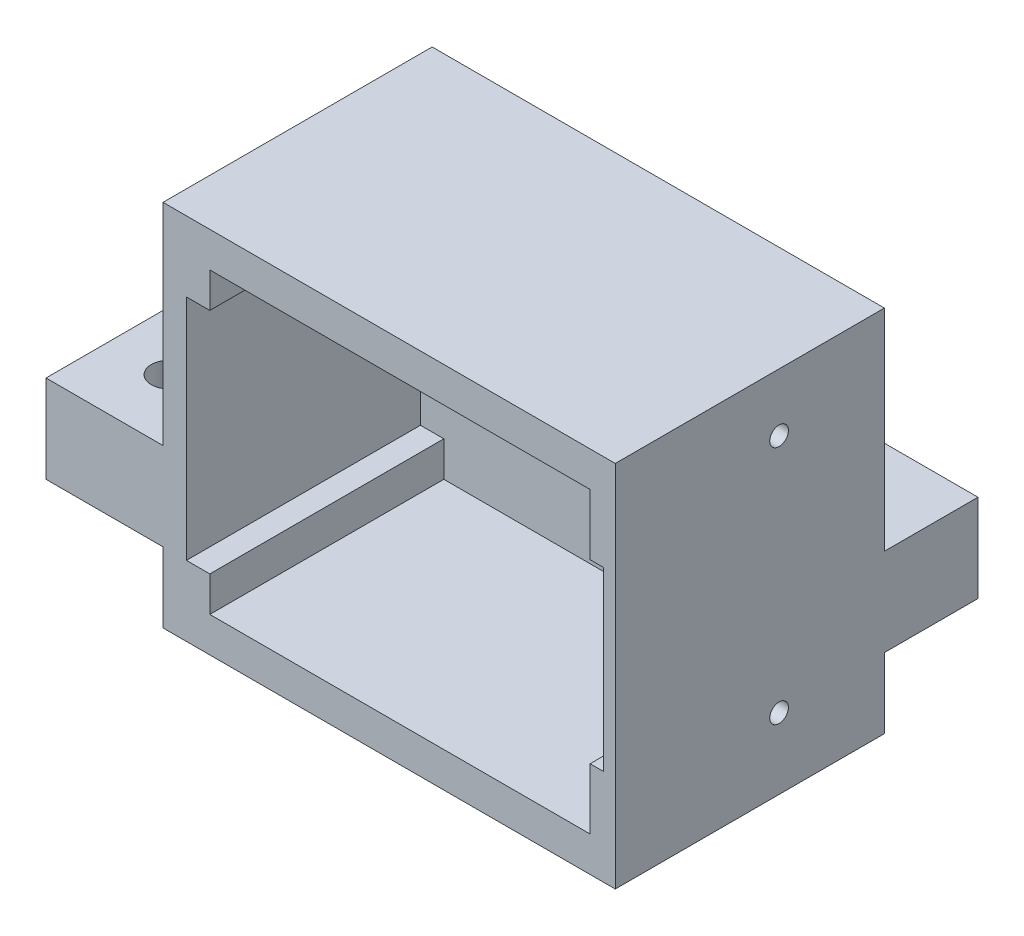
ISO-10303-21;
HEADER;
FILE_DESCRIPTION(('STEP AP214'),'2;1');
FILE_NAME('part.step','',(''),(''),'','','');
FILE_SCHEMA(('AUTOMOTIVE_DESIGN { 1 0 10303 214 1 1 1 1 }'));
ENDSEC;
DATA;
#1=APPLICATION_CONTEXT('core data for automotive mechanical design processes');
#2=APPLICATION_PROTOCOL_DEFINITION('international standard','automotive_design',2000,#1);
#3=PRODUCT_CONTEXT('',#1,'mechanical');
#4=PRODUCT('Part','Part','',(#3));
#5=PRODUCT_RELATED_PRODUCT_CATEGORY('part','',(#4));
#6=PRODUCT_DEFINITION_FORMATION('','',#4);
#7=PRODUCT_DEFINITION_CONTEXT('part definition',#1,'design');
#8=PRODUCT_DEFINITION('design','',#6,#7);
#9=PRODUCT_DEFINITION_SHAPE('','',#8);
#10=(LENGTH_UNIT() NAMED_UNIT(*) SI_UNIT(.MILLI.,.METRE.));
#11=(NAMED_UNIT(*) PLANE_ANGLE_UNIT() SI_UNIT($,.RADIAN.));
#12=(NAMED_UNIT(*) SI_UNIT($,.STERADIAN.) SOLID_ANGLE_UNIT());
#13=UNCERTAINTY_MEASURE_WITH_UNIT(LENGTH_MEASURE(1.E-05),#10,'distance_accuracy_value','');
#14=(GEOMETRIC_REPRESENTATION_CONTEXT(3) GLOBAL_UNCERTAINTY_ASSIGNED_CONTEXT((#13)) GLOBAL_UNIT_ASSIGNED_CONTEXT((#10,
#11,#12)) REPRESENTATION_CONTEXT('',''));
#15=CARTESIAN_POINT('',(0.,0.,0.));
#16=DIRECTION('',(0.,0.,1.));
#17=DIRECTION('',(1.,0.,0.));
#18=AXIS2_PLACEMENT_3D('',#15,#16,#17);
#19=CARTESIAN_POINT('',(0.,31.5,0.));
#20=DIRECTION('',(1.,0.,0.));
#21=DIRECTION('',(0.,0.,-1.));
#22=AXIS2_PLACEMENT_3D('',#19,#20,#21);
#23=PLANE('',#22);
#24=DIRECTION('',(0.,0.,-1.));
#25=VECTOR('',#24,1.);
#26=CARTESIAN_POINT('',(0.,13.5,0.));
#27=LINE('',#26,#25);
#28=CARTESIAN_POINT('',(0.,13.5,0.));
#29=VERTEX_POINT('',#28);
#30=CARTESIAN_POINT('',(0.,13.5,-23.));
#31=VERTEX_POINT('',#30);
#32=EDGE_CURVE('E213',#29,#31,#27,.T.);
#33=ORIENTED_EDGE('',*,*,#32,.F.);
#34=DIRECTION('',(0.,-1.,0.));
#35=VECTOR('',#34,1.);
#36=CARTESIAN_POINT('',(0.,31.5,0.));
#37=LINE('',#36,#35);
#38=CARTESIAN_POINT('',(0.,31.5,0.));
#39=VERTEX_POINT('',#38);
#40=EDGE_CURVE('E11',#39,#29,#37,.T.);
#41=ORIENTED_EDGE('',*,*,#40,.F.);
#42=DIRECTION('',(0.,0.,1.));
#43=VECTOR('',#42,1.);
#44=CARTESIAN_POINT('',(0.,31.5,0.));
#45=LINE('',#44,#43);
#46=CARTESIAN_POINT('',(0.,31.5,-23.));
#47=VERTEX_POINT('',#46);
#48=EDGE_CURVE('E400',#47,#39,#45,.T.);
#49=ORIENTED_EDGE('',*,*,#48,.F.);
#50=DIRECTION('',(0.,-1.,0.));
#51=VECTOR('',#50,1.);
#52=CARTESIAN_POINT('',(0.,31.5,-23.));
#53=LINE('',#52,#51);
#54=EDGE_CURVE('E419',#47,#31,#53,.T.);
#55=ORIENTED_EDGE('',*,*,#54,.T.);
#56=EDGE_LOOP('',(#33,#41,#49,#55));
#57=FACE_BOUND('',#56,.T.);
#58=ADVANCED_FACE('F44',(#57),#23,.F.);
#59=CARTESIAN_POINT('',(0.,6.,0.));
#60=VERTEX_POINT('',#59);
#61=CARTESIAN_POINT('',(0.,0.,0.));
#62=VERTEX_POINT('',#61);
#63=EDGE_CURVE('E52',#60,#62,#37,.T.);
#64=ORIENTED_EDGE('',*,*,#63,.F.);
#65=DIRECTION('',(0.,0.,-1.));
#66=VECTOR('',#65,1.);
#67=CARTESIAN_POINT('',(0.,6.,0.));
#68=LINE('',#67,#66);
#69=CARTESIAN_POINT('',(0.,6.,-23.));
#70=VERTEX_POINT('',#69);
#71=EDGE_CURVE('E59',#60,#70,#68,.T.);
#72=ORIENTED_EDGE('',*,*,#71,.T.);
#73=CARTESIAN_POINT('',(0.,0.,-23.));
#74=VERTEX_POINT('',#73);
#75=EDGE_CURVE('E410',#70,#74,#53,.T.);
#76=ORIENTED_EDGE('',*,*,#75,.T.);
#77=DIRECTION('',(0.,0.,1.));
#78=VECTOR('',#77,1.);
#79=CARTESIAN_POINT('',(0.,0.,0.));
#80=LINE('',#79,#78);
#81=EDGE_CURVE('E377',#74,#62,#80,.T.);
#82=ORIENTED_EDGE('',*,*,#81,.T.);
#83=EDGE_LOOP('',(#64,#72,#76,#82));
#84=FACE_BOUND('',#83,.T.);
#85=ADVANCED_FACE('F46',(#84),#23,.F.);
#86=CARTESIAN_POINT('',(0.,31.5,0.));
#87=DIRECTION('',(0.,0.,-1.));
#88=DIRECTION('',(-1.,0.,0.));
#89=AXIS2_PLACEMENT_3D('',#86,#87,#88);
#90=PLANE('',#89);
#91=DIRECTION('',(-1.,0.,0.));
#92=VECTOR('',#91,1.);
#93=CARTESIAN_POINT('',(4.,25.5,0.));
#94=LINE('',#93,#92);
#95=CARTESIAN_POINT('',(4.,25.5,0.));
#96=VERTEX_POINT('',#95);
#97=CARTESIAN_POINT('',(2.,25.5,0.));
#98=VERTEX_POINT('',#97);
#99=EDGE_CURVE('E343',#96,#98,#94,.T.);
#100=ORIENTED_EDGE('',*,*,#99,.F.);
#101=DIRECTION('',(0.,-1.,0.));
#102=VECTOR('',#101,1.);
#103=CARTESIAN_POINT('',(4.,28.5,0.));
#104=LINE('',#103,#102);
#105=CARTESIAN_POINT('',(4.,28.5,0.));
#106=VERTEX_POINT('',#105);
#107=EDGE_CURVE('E299',#106,#96,#104,.T.);
#108=ORIENTED_EDGE('',*,*,#107,.F.);
#109=DIRECTION('',(-1.,0.,0.));
#110=VECTOR('',#109,1.);
#111=CARTESIAN_POINT('',(36.5,28.5,0.));
#112=LINE('',#111,#110);
#113=CARTESIAN_POINT('',(36.5,28.5,0.));
#114=VERTEX_POINT('',#113);
#115=EDGE_CURVE('E308',#114,#106,#112,.T.);
#116=ORIENTED_EDGE('',*,*,#115,.F.);
#117=DIRECTION('',(0.,1.,0.));
#118=VECTOR('',#117,1.);
#119=CARTESIAN_POINT('',(36.5,23.3,0.));
#120=LINE('',#119,#118);
#121=CARTESIAN_POINT('',(36.5,23.3,0.));
#122=VERTEX_POINT('',#121);
#123=EDGE_CURVE('E370',#122,#114,#120,.T.);
#124=ORIENTED_EDGE('',*,*,#123,.F.);
#125=DIRECTION('',(-1.,0.,0.));
#126=VECTOR('',#125,1.);
#127=CARTESIAN_POINT('',(37.65,23.3,0.));
#128=LINE('',#127,#126);
#129=CARTESIAN_POINT('',(37.65,23.3,0.));
#130=VERTEX_POINT('',#129);
#131=EDGE_CURVE('E367',#130,#122,#128,.T.);
#132=ORIENTED_EDGE('',*,*,#131,.F.);
#133=DIRECTION('',(0.,1.,0.));
#134=VECTOR('',#133,1.);
#135=CARTESIAN_POINT('',(37.65,8.2,0.));
#136=LINE('',#135,#134);
#137=CARTESIAN_POINT('',(37.65,8.2,0.));
#138=VERTEX_POINT('',#137);
#139=EDGE_CURVE('E364',#138,#130,#136,.T.);
#140=ORIENTED_EDGE('',*,*,#139,.F.);
#141=DIRECTION('',(1.,0.,0.));
#142=VECTOR('',#141,1.);
#143=CARTESIAN_POINT('',(36.5,8.2,0.));
#144=LINE('',#143,#142);
#145=CARTESIAN_POINT('',(36.5,8.2,0.));
#146=VERTEX_POINT('',#145);
#147=EDGE_CURVE('E361',#146,#138,#144,.T.);
#148=ORIENTED_EDGE('',*,*,#147,.F.);
#149=DIRECTION('',(0.,1.,0.));
#150=VECTOR('',#149,1.);
#151=CARTESIAN_POINT('',(36.5,3.,0.));
#152=LINE('',#151,#150);
#153=CARTESIAN_POINT('',(36.5,3.,0.));
#154=VERTEX_POINT('',#153);
#155=EDGE_CURVE('E358',#154,#146,#152,.T.);
#156=ORIENTED_EDGE('',*,*,#155,.F.);
#157=DIRECTION('',(1.,0.,0.));
#158=VECTOR('',#157,1.);
#159=CARTESIAN_POINT('',(4.,3.,0.));
#160=LINE('',#159,#158);
#161=CARTESIAN_POINT('',(4.,3.,0.));
#162=VERTEX_POINT('',#161);
#163=EDGE_CURVE('E355',#162,#154,#160,.T.);
#164=ORIENTED_EDGE('',*,*,#163,.F.);
#165=DIRECTION('',(0.,-1.,0.));
#166=VECTOR('',#165,1.);
#167=CARTESIAN_POINT('',(4.,6.,0.));
#168=LINE('',#167,#166);
#169=CARTESIAN_POINT('',(4.,6.,0.));
#170=VERTEX_POINT('',#169);
#171=EDGE_CURVE('E352',#170,#162,#168,.T.);
#172=ORIENTED_EDGE('',*,*,#171,.F.);
#173=DIRECTION('',(1.,0.,0.));
#174=VECTOR('',#173,1.);
#175=CARTESIAN_POINT('',(2.,6.,0.));
#176=LINE('',#175,#174);
#177=CARTESIAN_POINT('',(2.,6.,0.));
#178=VERTEX_POINT('',#177);
#179=EDGE_CURVE('E349',#178,#170,#176,.T.);
#180=ORIENTED_EDGE('',*,*,#179,.F.);
#181=DIRECTION('',(0.,-1.,0.));
#182=VECTOR('',#181,1.);
#183=CARTESIAN_POINT('',(2.,25.5,0.));
#184=LINE('',#183,#182);
#185=EDGE_CURVE('E346',#98,#178,#184,.T.);
#186=ORIENTED_EDGE('',*,*,#185,.F.);
#187=EDGE_LOOP('',(#100,#108,#116,#124,#132,#140,#148,#156,#164,#172,#180,#186));
#188=FACE_BOUND('',#187,.T.);
#189=DIRECTION('',(1.,0.,0.));
#190=VECTOR('',#189,1.);
#191=CARTESIAN_POINT('',(0.,0.,0.));
#192=LINE('',#191,#190);
#193=CARTESIAN_POINT('',(38.65,0.,0.));
#194=VERTEX_POINT('',#193);
#195=EDGE_CURVE('E412',#62,#194,#192,.T.);
#196=ORIENTED_EDGE('',*,*,#195,.T.);
#197=DIRECTION('',(0.,-1.,0.));
#198=VECTOR('',#197,1.);
#199=CARTESIAN_POINT('',(38.65,31.5,0.));
#200=LINE('',#199,#198);
#201=CARTESIAN_POINT('',(38.65,31.5,0.));
#202=VERTEX_POINT('',#201);
#203=EDGE_CURVE('E424',#202,#194,#200,.T.);
#204=ORIENTED_EDGE('',*,*,#203,.F.);
#205=DIRECTION('',(1.,0.,0.));
#206=VECTOR('',#205,1.);
#207=CARTESIAN_POINT('',(0.,31.5,0.));
#208=LINE('',#207,#206);
#209=EDGE_CURVE('E403',#39,#202,#208,.T.);
#210=ORIENTED_EDGE('',*,*,#209,.F.);
#211=ORIENTED_EDGE('',*,*,#40,.T.);
#212=DIRECTION('',(-1.,0.,0.));
#213=VECTOR('',#212,1.);
#214=CARTESIAN_POINT('',(0.,13.5,0.));
#215=LINE('',#214,#213);
#216=CARTESIAN_POINT('',(-10.,13.5,0.));
#217=VERTEX_POINT('',#216);
#218=EDGE_CURVE('E219',#29,#217,#215,.T.);
#219=ORIENTED_EDGE('',*,*,#218,.T.);
#220=DIRECTION('',(0.,-1.,0.));
#221=VECTOR('',#220,1.);
#222=CARTESIAN_POINT('',(-10.,13.5,0.));
#223=LINE('',#222,#221);
#224=CARTESIAN_POINT('',(-10.,6.,0.));
#225=VERTEX_POINT('',#224);
#226=EDGE_CURVE('E202',#217,#225,#223,.T.);
#227=ORIENTED_EDGE('',*,*,#226,.T.);
#228=DIRECTION('',(-1.,0.,0.));
#229=VECTOR('',#228,1.);
#230=CARTESIAN_POINT('',(0.,6.,0.));
#231=LINE('',#230,#229);
#232=EDGE_CURVE('E241',#60,#225,#231,.T.);
#233=ORIENTED_EDGE('',*,*,#232,.F.);
#234=ORIENTED_EDGE('',*,*,#63,.T.);
#235=EDGE_LOOP('',(#196,#204,#210,#211,#219,#227,#233,#234));
#236=FACE_BOUND('',#235,.T.);
#237=ADVANCED_FACE('F224',(#188,#236),#90,.F.);
#238=CARTESIAN_POINT('',(38.65,31.5,0.));
#239=DIRECTION('',(-1.,0.,0.));
#240=DIRECTION('',(0.,0.,1.));
#241=AXIS2_PLACEMENT_3D('',#238,#239,#240);
#242=PLANE('',#241);
#243=CARTESIAN_POINT('',(38.65,26.55,-14.));
#244=DIRECTION('',(-1.,0.,0.));
#245=DIRECTION('',(0.,0.,1.));
#246=AXIS2_PLACEMENT_3D('',#243,#244,#245);
#247=CIRCLE('',#246,0.8);
#248=CARTESIAN_POINT('',(38.65,26.55,-13.2));
#249=VERTEX_POINT('',#248);
#250=EDGE_CURVE('E295',#249,#249,#247,.F.);
#251=ORIENTED_EDGE('',*,*,#250,.F.);
#252=EDGE_LOOP('',(#251));
#253=FACE_BOUND('',#252,.T.);
#254=CARTESIAN_POINT('',(38.65,6.05,-14.));
#255=DIRECTION('',(-1.,0.,0.));
#256=DIRECTION('',(0.,0.,1.));
#257=AXIS2_PLACEMENT_3D('',#254,#255,#256);
#258=CIRCLE('',#257,0.800000000000001);
#259=CARTESIAN_POINT('',(38.65,6.05,-13.2));
#260=VERTEX_POINT('',#259);
#261=EDGE_CURVE('E296',#260,#260,#258,.F.);
#262=ORIENTED_EDGE('',*,*,#261,.F.);
#263=EDGE_LOOP('',(#262));
#264=FACE_BOUND('',#263,.T.);
#265=DIRECTION('',(0.,0.,-1.));
#266=VECTOR('',#265,1.);
#267=CARTESIAN_POINT('',(38.65,0.,0.));
#268=LINE('',#267,#266);
#269=CARTESIAN_POINT('',(38.65,0.,-23.));
#270=VERTEX_POINT('',#269);
#271=EDGE_CURVE('E414',#194,#270,#268,.T.);
#272=ORIENTED_EDGE('',*,*,#271,.T.);
#273=DIRECTION('',(0.,-1.,0.));
#274=VECTOR('',#273,1.);
#275=CARTESIAN_POINT('',(38.65,31.5,-23.));
#276=LINE('',#275,#274);
#277=CARTESIAN_POINT('',(38.65,6.,-23.));
#278=VERTEX_POINT('',#277);
#279=EDGE_CURVE('E421',#278,#270,#276,.T.);
#280=ORIENTED_EDGE('',*,*,#279,.F.);
#281=DIRECTION('',(0.,0.,-1.));
#282=VECTOR('',#281,1.);
#283=CARTESIAN_POINT('',(38.65,6.,0.));
#284=LINE('',#283,#282);
#285=CARTESIAN_POINT('',(38.65,6.,-31.));
#286=VERTEX_POINT('',#285);
#287=EDGE_CURVE('E254',#278,#286,#284,.T.);
#288=ORIENTED_EDGE('',*,*,#287,.T.);
#289=DIRECTION('',(0.,-1.,0.));
#290=VECTOR('',#289,1.);
#291=CARTESIAN_POINT('',(38.65,13.5,-31.));
#292=LINE('',#291,#290);
#293=CARTESIAN_POINT('',(38.65,13.5,-31.));
#294=VERTEX_POINT('',#293);
#295=EDGE_CURVE('E285',#294,#286,#292,.T.);
#296=ORIENTED_EDGE('',*,*,#295,.F.);
#297=DIRECTION('',(0.,0.,-1.));
#298=VECTOR('',#297,1.);
#299=CARTESIAN_POINT('',(38.65,13.5,0.));
#300=LINE('',#299,#298);
#301=CARTESIAN_POINT('',(38.65,13.5,-23.));
#302=VERTEX_POINT('',#301);
#303=EDGE_CURVE('E266',#302,#294,#300,.T.);
#304=ORIENTED_EDGE('',*,*,#303,.F.);
#305=CARTESIAN_POINT('',(38.65,31.5,-23.));
#306=VERTEX_POINT('',#305);
#307=EDGE_CURVE('E422',#306,#302,#276,.T.);
#308=ORIENTED_EDGE('',*,*,#307,.F.);
#309=DIRECTION('',(0.,0.,-1.));
#310=VECTOR('',#309,1.);
#311=CARTESIAN_POINT('',(38.65,31.5,0.));
#312=LINE('',#311,#310);
#313=EDGE_CURVE('E406',#202,#306,#312,.T.);
#314=ORIENTED_EDGE('',*,*,#313,.F.);
#315=ORIENTED_EDGE('',*,*,#203,.T.);
#316=EDGE_LOOP('',(#272,#280,#288,#296,#304,#308,#314,#315));
#317=FACE_BOUND('',#316,.T.);
#318=ADVANCED_FACE('F440',(#253,#264,#317),#242,.F.);
#319=CARTESIAN_POINT('',(0.,31.5,-23.));
#320=DIRECTION('',(0.,0.,1.));
#321=DIRECTION('',(1.,0.,0.));
#322=AXIS2_PLACEMENT_3D('',#319,#320,#321);
#323=PLANE('',#322);
#324=DIRECTION('',(0.,-1.,0.));
#325=VECTOR('',#324,1.);
#326=CARTESIAN_POINT('',(1.,13.5,-23.));
#327=LINE('',#326,#325);
#328=CARTESIAN_POINT('',(1.,13.5,-23.));
#329=VERTEX_POINT('',#328);
#330=CARTESIAN_POINT('',(1.,6.,-23.));
#331=VERTEX_POINT('',#330);
#332=EDGE_CURVE('E268',#329,#331,#327,.T.);
#333=ORIENTED_EDGE('',*,*,#332,.T.);
#334=DIRECTION('',(1.,0.,0.));
#335=VECTOR('',#334,1.);
#336=CARTESIAN_POINT('',(0.,6.,-23.));
#337=LINE('',#336,#335);
#338=EDGE_CURVE('E274',#331,#278,#337,.T.);
#339=ORIENTED_EDGE('',*,*,#338,.T.);
#340=ORIENTED_EDGE('',*,*,#279,.T.);
#341=DIRECTION('',(-1.,0.,0.));
#342=VECTOR('',#341,1.);
#343=CARTESIAN_POINT('',(0.,0.,-23.));
#344=LINE('',#343,#342);
#345=EDGE_CURVE('E404',#270,#74,#344,.T.);
#346=ORIENTED_EDGE('',*,*,#345,.T.);
#347=ORIENTED_EDGE('',*,*,#75,.F.);
#348=DIRECTION('',(-1.,0.,0.));
#349=VECTOR('',#348,1.);
#350=CARTESIAN_POINT('',(0.,6.,-23.));
#351=LINE('',#350,#349);
#352=CARTESIAN_POINT('',(-9.99999999999999,6.,-23.));
#353=VERTEX_POINT('',#352);
#354=EDGE_CURVE('E244',#70,#353,#351,.T.);
#355=ORIENTED_EDGE('',*,*,#354,.T.);
#356=DIRECTION('',(0.,-1.,0.));
#357=VECTOR('',#356,1.);
#358=CARTESIAN_POINT('',(-9.99999999999999,13.5,-23.));
#359=LINE('',#358,#357);
#360=CARTESIAN_POINT('',(-9.99999999999999,13.5,-23.));
#361=VERTEX_POINT('',#360);
#362=EDGE_CURVE('E212',#361,#353,#359,.T.);
#363=ORIENTED_EDGE('',*,*,#362,.F.);
#364=DIRECTION('',(-1.,0.,0.));
#365=VECTOR('',#364,1.);
#366=CARTESIAN_POINT('',(0.,13.5,-23.));
#367=LINE('',#366,#365);
#368=EDGE_CURVE('E221',#31,#361,#367,.T.);
#369=ORIENTED_EDGE('',*,*,#368,.F.);
#370=ORIENTED_EDGE('',*,*,#54,.F.);
#371=DIRECTION('',(-1.,0.,0.));
#372=VECTOR('',#371,1.);
#373=CARTESIAN_POINT('',(0.,31.5,-23.));
#374=LINE('',#373,#372);
#375=EDGE_CURVE('E408',#306,#47,#374,.T.);
#376=ORIENTED_EDGE('',*,*,#375,.F.);
#377=ORIENTED_EDGE('',*,*,#307,.T.);
#378=DIRECTION('',(1.,0.,0.));
#379=VECTOR('',#378,1.);
#380=CARTESIAN_POINT('',(0.,13.5,-23.));
#381=LINE('',#380,#379);
#382=EDGE_CURVE('E257',#329,#302,#381,.T.);
#383=ORIENTED_EDGE('',*,*,#382,.F.);
#384=EDGE_LOOP('',(#333,#339,#340,#346,#347,#355,#363,#369,#370,#376,#377,#383));
#385=FACE_BOUND('',#384,.T.);
#386=ADVANCED_FACE('F437',(#385),#323,.F.);
#387=CARTESIAN_POINT('',(0.,31.5,0.));
#388=DIRECTION('',(0.,-1.,0.));
#389=DIRECTION('',(0.,0.,-1.));
#390=AXIS2_PLACEMENT_3D('',#387,#388,#389);
#391=PLANE('',#390);
#392=ORIENTED_EDGE('',*,*,#48,.T.);
#393=ORIENTED_EDGE('',*,*,#209,.T.);
#394=ORIENTED_EDGE('',*,*,#313,.T.);
#395=ORIENTED_EDGE('',*,*,#375,.T.);
#396=EDGE_LOOP('',(#392,#393,#394,#395));
#397=FACE_BOUND('',#396,.T.);
#398=ADVANCED_FACE('F448',(#397),#391,.F.);
#399=CARTESIAN_POINT('',(0.,0.,0.));
#400=DIRECTION('',(0.,-1.,0.));
#401=DIRECTION('',(0.,0.,-1.));
#402=AXIS2_PLACEMENT_3D('',#399,#400,#401);
#403=PLANE('',#402);
#404=ORIENTED_EDGE('',*,*,#81,.F.);
#405=ORIENTED_EDGE('',*,*,#345,.F.);
#406=ORIENTED_EDGE('',*,*,#271,.F.);
#407=ORIENTED_EDGE('',*,*,#195,.F.);
#408=EDGE_LOOP('',(#404,#405,#406,#407));
#409=FACE_BOUND('',#408,.T.);
#410=ADVANCED_FACE('F433',(#409),#403,.T.);
#411=CARTESIAN_POINT('',(4.,28.5,-20.));
#412=DIRECTION('',(-1.,0.,0.));
#413=DIRECTION('',(0.,-1.,0.));
#414=AXIS2_PLACEMENT_3D('',#411,#412,#413);
#415=PLANE('',#414);
#416=ORIENTED_EDGE('',*,*,#107,.T.);
#417=DIRECTION('',(0.,0.,1.));
#418=VECTOR('',#417,1.);
#419=CARTESIAN_POINT('',(4.,25.5,-20.));
#420=LINE('',#419,#418);
#421=CARTESIAN_POINT('',(4.,25.5,-20.));
#422=VERTEX_POINT('',#421);
#423=EDGE_CURVE('E341',#422,#96,#420,.T.);
#424=ORIENTED_EDGE('',*,*,#423,.F.);
#425=DIRECTION('',(0.,-1.,0.));
#426=VECTOR('',#425,1.);
#427=CARTESIAN_POINT('',(4.,28.5,-20.));
#428=LINE('',#427,#426);
#429=CARTESIAN_POINT('',(4.,28.5,-20.));
#430=VERTEX_POINT('',#429);
#431=EDGE_CURVE('E304',#430,#422,#428,.T.);
#432=ORIENTED_EDGE('',*,*,#431,.F.);
#433=DIRECTION('',(0.,0.,1.));
#434=VECTOR('',#433,1.);
#435=CARTESIAN_POINT('',(4.,28.5,-20.));
#436=LINE('',#435,#434);
#437=EDGE_CURVE('E375',#430,#106,#436,.T.);
#438=ORIENTED_EDGE('',*,*,#437,.T.);
#439=EDGE_LOOP('',(#416,#424,#432,#438));
#440=FACE_BOUND('',#439,.T.);
#441=ADVANCED_FACE('F525',(#440),#415,.F.);
#442=CARTESIAN_POINT('',(36.5,28.5,-20.));
#443=DIRECTION('',(0.,1.,0.));
#444=DIRECTION('',(-1.,0.,0.));
#445=AXIS2_PLACEMENT_3D('',#442,#443,#444);
#446=PLANE('',#445);
#447=ORIENTED_EDGE('',*,*,#115,.T.);
#448=ORIENTED_EDGE('',*,*,#437,.F.);
#449=DIRECTION('',(-1.,0.,0.));
#450=VECTOR('',#449,1.);
#451=CARTESIAN_POINT('',(36.5,28.5,-20.));
#452=LINE('',#451,#450);
#453=CARTESIAN_POINT('',(36.5,28.5,-20.));
#454=VERTEX_POINT('',#453);
#455=EDGE_CURVE('E338',#454,#430,#452,.T.);
#456=ORIENTED_EDGE('',*,*,#455,.F.);
#457=DIRECTION('',(0.,0.,1.));
#458=VECTOR('',#457,1.);
#459=CARTESIAN_POINT('',(36.5,28.5,-20.));
#460=LINE('',#459,#458);
#461=EDGE_CURVE('E378',#454,#114,#460,.T.);
#462=ORIENTED_EDGE('',*,*,#461,.T.);
#463=EDGE_LOOP('',(#447,#448,#456,#462));
#464=FACE_BOUND('',#463,.T.);
#465=ADVANCED_FACE('F521',(#464),#446,.F.);
#466=CARTESIAN_POINT('',(36.5,23.3,-20.));
#467=DIRECTION('',(1.,0.,0.));
#468=DIRECTION('',(0.,1.,0.));
#469=AXIS2_PLACEMENT_3D('',#466,#467,#468);
#470=PLANE('',#469);
#471=CARTESIAN_POINT('',(36.5,26.55,-14.));
#472=DIRECTION('',(-1.,0.,0.));
#473=DIRECTION('',(0.,0.,1.));
#474=AXIS2_PLACEMENT_3D('',#471,#472,#473);
#475=CIRCLE('',#474,0.8);
#476=CARTESIAN_POINT('',(36.5,26.55,-13.2));
#477=VERTEX_POINT('',#476);
#478=EDGE_CURVE('E292',#477,#477,#475,.T.);
#479=ORIENTED_EDGE('',*,*,#478,.F.);
#480=EDGE_LOOP('',(#479));
#481=FACE_BOUND('',#480,.T.);
#482=ORIENTED_EDGE('',*,*,#123,.T.);
#483=ORIENTED_EDGE('',*,*,#461,.F.);
#484=DIRECTION('',(0.,1.,0.));
#485=VECTOR('',#484,1.);
#486=CARTESIAN_POINT('',(36.5,23.3,-20.));
#487=LINE('',#486,#485);
#488=CARTESIAN_POINT('',(36.5,23.3,-20.));
#489=VERTEX_POINT('',#488);
#490=EDGE_CURVE('E335',#489,#454,#487,.T.);
#491=ORIENTED_EDGE('',*,*,#490,.F.);
#492=DIRECTION('',(0.,0.,1.));
#493=VECTOR('',#492,1.);
#494=CARTESIAN_POINT('',(36.5,23.3,-20.));
#495=LINE('',#494,#493);
#496=EDGE_CURVE('E380',#489,#122,#495,.T.);
#497=ORIENTED_EDGE('',*,*,#496,.T.);
#498=EDGE_LOOP('',(#482,#483,#491,#497));
#499=FACE_BOUND('',#498,.T.);
#500=ADVANCED_FACE('F524',(#481,#499),#470,.F.);
#501=CARTESIAN_POINT('',(37.65,23.3,-20.));
#502=DIRECTION('',(0.,1.,0.));
#503=DIRECTION('',(0.,0.,1.));
#504=AXIS2_PLACEMENT_3D('',#501,#502,#503);
#505=PLANE('',#504);
#506=ORIENTED_EDGE('',*,*,#131,.T.);
#507=ORIENTED_EDGE('',*,*,#496,.F.);
#508=DIRECTION('',(-1.,0.,0.));
#509=VECTOR('',#508,1.);
#510=CARTESIAN_POINT('',(37.65,23.3,-20.));
#511=LINE('',#510,#509);
#512=CARTESIAN_POINT('',(37.65,23.3,-20.));
#513=VERTEX_POINT('',#512);
#514=EDGE_CURVE('E332',#513,#489,#511,.T.);
#515=ORIENTED_EDGE('',*,*,#514,.F.);
#516=DIRECTION('',(0.,0.,1.));
#517=VECTOR('',#516,1.);
#518=CARTESIAN_POINT('',(37.65,23.3,-20.));
#519=LINE('',#518,#517);
#520=EDGE_CURVE('E382',#513,#130,#519,.T.);
#521=ORIENTED_EDGE('',*,*,#520,.T.);
#522=EDGE_LOOP('',(#506,#507,#515,#521));
#523=FACE_BOUND('',#522,.T.);
#524=ADVANCED_FACE('F529',(#523),#505,.F.);
#525=CARTESIAN_POINT('',(37.65,8.2,-20.));
#526=DIRECTION('',(1.,0.,0.));
#527=DIRECTION('',(0.,0.,-1.));
#528=AXIS2_PLACEMENT_3D('',#525,#526,#527);
#529=PLANE('',#528);
#530=ORIENTED_EDGE('',*,*,#139,.T.);
#531=ORIENTED_EDGE('',*,*,#520,.F.);
#532=DIRECTION('',(0.,1.,0.));
#533=VECTOR('',#532,1.);
#534=CARTESIAN_POINT('',(37.65,8.2,-20.));
#535=LINE('',#534,#533);
#536=CARTESIAN_POINT('',(37.65,8.2,-20.));
#537=VERTEX_POINT('',#536);
#538=EDGE_CURVE('E329',#537,#513,#535,.T.);
#539=ORIENTED_EDGE('',*,*,#538,.F.);
#540=DIRECTION('',(0.,0.,1.));
#541=VECTOR('',#540,1.);
#542=CARTESIAN_POINT('',(37.65,8.2,-20.));
#543=LINE('',#542,#541);
#544=EDGE_CURVE('E384',#537,#138,#543,.T.);
#545=ORIENTED_EDGE('',*,*,#544,.T.);
#546=EDGE_LOOP('',(#530,#531,#539,#545));
#547=FACE_BOUND('',#546,.T.);
#548=ADVANCED_FACE('F533',(#547),#529,.F.);
#549=CARTESIAN_POINT('',(36.5,8.2,-20.));
#550=DIRECTION('',(0.,-1.,0.));
#551=DIRECTION('',(0.,0.,-1.));
#552=AXIS2_PLACEMENT_3D('',#549,#550,#551);
#553=PLANE('',#552);
#554=ORIENTED_EDGE('',*,*,#147,.T.);
#555=ORIENTED_EDGE('',*,*,#544,.F.);
#556=DIRECTION('',(1.,0.,0.));
#557=VECTOR('',#556,1.);
#558=CARTESIAN_POINT('',(36.5,8.2,-20.));
#559=LINE('',#558,#557);
#560=CARTESIAN_POINT('',(36.5,8.2,-20.));
#561=VERTEX_POINT('',#560);
#562=EDGE_CURVE('E326',#561,#537,#559,.T.);
#563=ORIENTED_EDGE('',*,*,#562,.F.);
#564=DIRECTION('',(0.,0.,1.));
#565=VECTOR('',#564,1.);
#566=CARTESIAN_POINT('',(36.5,8.2,-20.));
#567=LINE('',#566,#565);
#568=EDGE_CURVE('E386',#561,#146,#567,.T.);
#569=ORIENTED_EDGE('',*,*,#568,.T.);
#570=EDGE_LOOP('',(#554,#555,#563,#569));
#571=FACE_BOUND('',#570,.T.);
#572=ADVANCED_FACE('F537',(#571),#553,.F.);
#573=CARTESIAN_POINT('',(36.5,3.,-20.));
#574=DIRECTION('',(1.,0.,0.));
#575=DIRECTION('',(0.,0.,-1.));
#576=AXIS2_PLACEMENT_3D('',#573,#574,#575);
#577=PLANE('',#576);
#578=CARTESIAN_POINT('',(36.5,6.05,-14.));
#579=DIRECTION('',(-1.,0.,0.));
#580=DIRECTION('',(0.,0.,1.));
#581=AXIS2_PLACEMENT_3D('',#578,#579,#580);
#582=CIRCLE('',#581,0.800000000000001);
#583=CARTESIAN_POINT('',(36.5,6.05,-13.2));
#584=VERTEX_POINT('',#583);
#585=EDGE_CURVE('E287',#584,#584,#582,.T.);
#586=ORIENTED_EDGE('',*,*,#585,.F.);
#587=EDGE_LOOP('',(#586));
#588=FACE_BOUND('',#587,.T.);
#589=ORIENTED_EDGE('',*,*,#155,.T.);
#590=ORIENTED_EDGE('',*,*,#568,.F.);
#591=DIRECTION('',(0.,1.,0.));
#592=VECTOR('',#591,1.);
#593=CARTESIAN_POINT('',(36.5,3.,-20.));
#594=LINE('',#593,#592);
#595=CARTESIAN_POINT('',(36.5,3.,-20.));
#596=VERTEX_POINT('',#595);
#597=EDGE_CURVE('E323',#596,#561,#594,.T.);
#598=ORIENTED_EDGE('',*,*,#597,.F.);
#599=DIRECTION('',(0.,0.,1.));
#600=VECTOR('',#599,1.);
#601=CARTESIAN_POINT('',(36.5,3.,-20.));
#602=LINE('',#601,#600);
#603=EDGE_CURVE('E388',#596,#154,#602,.T.);
#604=ORIENTED_EDGE('',*,*,#603,.T.);
#605=EDGE_LOOP('',(#589,#590,#598,#604));
#606=FACE_BOUND('',#605,.T.);
#607=ADVANCED_FACE('F541',(#588,#606),#577,.F.);
#608=CARTESIAN_POINT('',(4.,3.,-20.));
#609=DIRECTION('',(0.,-1.,0.));
#610=DIRECTION('',(0.,0.,-1.));
#611=AXIS2_PLACEMENT_3D('',#608,#609,#610);
#612=PLANE('',#611);
#613=ORIENTED_EDGE('',*,*,#163,.T.);
#614=ORIENTED_EDGE('',*,*,#603,.F.);
#615=DIRECTION('',(1.,0.,0.));
#616=VECTOR('',#615,1.);
#617=CARTESIAN_POINT('',(4.,3.,-20.));
#618=LINE('',#617,#616);
#619=CARTESIAN_POINT('',(4.,3.,-20.));
#620=VERTEX_POINT('',#619);
#621=EDGE_CURVE('E320',#620,#596,#618,.T.);
#622=ORIENTED_EDGE('',*,*,#621,.F.);
#623=DIRECTION('',(0.,0.,1.));
#624=VECTOR('',#623,1.);
#625=CARTESIAN_POINT('',(4.,3.,-20.));
#626=LINE('',#625,#624);
#627=EDGE_CURVE('E390',#620,#162,#626,.T.);
#628=ORIENTED_EDGE('',*,*,#627,.T.);
#629=EDGE_LOOP('',(#613,#614,#622,#628));
#630=FACE_BOUND('',#629,.T.);
#631=ADVANCED_FACE('F545',(#630),#612,.F.);
#632=CARTESIAN_POINT('',(4.,6.,-20.));
#633=DIRECTION('',(-1.,0.,0.));
#634=DIRECTION('',(0.,0.,1.));
#635=AXIS2_PLACEMENT_3D('',#632,#633,#634);
#636=PLANE('',#635);
#637=ORIENTED_EDGE('',*,*,#171,.T.);
#638=ORIENTED_EDGE('',*,*,#627,.F.);
#639=DIRECTION('',(0.,-1.,0.));
#640=VECTOR('',#639,1.);
#641=CARTESIAN_POINT('',(4.,6.,-20.));
#642=LINE('',#641,#640);
#643=CARTESIAN_POINT('',(4.,6.,-20.));
#644=VERTEX_POINT('',#643);
#645=EDGE_CURVE('E317',#644,#620,#642,.T.);
#646=ORIENTED_EDGE('',*,*,#645,.F.);
#647=DIRECTION('',(0.,0.,1.));
#648=VECTOR('',#647,1.);
#649=CARTESIAN_POINT('',(4.,6.,-20.));
#650=LINE('',#649,#648);
#651=EDGE_CURVE('E392',#644,#170,#650,.T.);
#652=ORIENTED_EDGE('',*,*,#651,.T.);
#653=EDGE_LOOP('',(#637,#638,#646,#652));
#654=FACE_BOUND('',#653,.T.);
#655=ADVANCED_FACE('F549',(#654),#636,.F.);
#656=CARTESIAN_POINT('',(2.,6.,-20.));
#657=DIRECTION('',(0.,-1.,0.));
#658=DIRECTION('',(0.,0.,-1.));
#659=AXIS2_PLACEMENT_3D('',#656,#657,#658);
#660=PLANE('',#659);
#661=ORIENTED_EDGE('',*,*,#179,.T.);
#662=ORIENTED_EDGE('',*,*,#651,.F.);
#663=DIRECTION('',(1.,0.,0.));
#664=VECTOR('',#663,1.);
#665=CARTESIAN_POINT('',(2.,6.,-20.));
#666=LINE('',#665,#664);
#667=CARTESIAN_POINT('',(2.,6.,-20.));
#668=VERTEX_POINT('',#667);
#669=EDGE_CURVE('E314',#668,#644,#666,.T.);
#670=ORIENTED_EDGE('',*,*,#669,.F.);
#671=DIRECTION('',(0.,0.,1.));
#672=VECTOR('',#671,1.);
#673=CARTESIAN_POINT('',(2.,6.,-20.));
#674=LINE('',#673,#672);
#675=EDGE_CURVE('E394',#668,#178,#674,.T.);
#676=ORIENTED_EDGE('',*,*,#675,.T.);
#677=EDGE_LOOP('',(#661,#662,#670,#676));
#678=FACE_BOUND('',#677,.T.);
#679=ADVANCED_FACE('F553',(#678),#660,.F.);
#680=CARTESIAN_POINT('',(2.,25.5,-20.));
#681=DIRECTION('',(-1.,0.,0.));
#682=DIRECTION('',(0.,-1.,0.));
#683=AXIS2_PLACEMENT_3D('',#680,#681,#682);
#684=PLANE('',#683);
#685=ORIENTED_EDGE('',*,*,#185,.T.);
#686=ORIENTED_EDGE('',*,*,#675,.F.);
#687=DIRECTION('',(0.,-1.,0.));
#688=VECTOR('',#687,1.);
#689=CARTESIAN_POINT('',(2.,25.5,-20.));
#690=LINE('',#689,#688);
#691=CARTESIAN_POINT('',(2.,25.5,-20.));
#692=VERTEX_POINT('',#691);
#693=EDGE_CURVE('E311',#692,#668,#690,.T.);
#694=ORIENTED_EDGE('',*,*,#693,.F.);
#695=DIRECTION('',(0.,0.,1.));
#696=VECTOR('',#695,1.);
#697=CARTESIAN_POINT('',(2.,25.5,-20.));
#698=LINE('',#697,#696);
#699=EDGE_CURVE('E396',#692,#98,#698,.T.);
#700=ORIENTED_EDGE('',*,*,#699,.T.);
#701=EDGE_LOOP('',(#685,#686,#694,#700));
#702=FACE_BOUND('',#701,.T.);
#703=ADVANCED_FACE('F557',(#702),#684,.F.);
#704=CARTESIAN_POINT('',(4.,25.5,-20.));
#705=DIRECTION('',(0.,1.,0.));
#706=DIRECTION('',(0.,0.,1.));
#707=AXIS2_PLACEMENT_3D('',#704,#705,#706);
#708=PLANE('',#707);
#709=ORIENTED_EDGE('',*,*,#99,.T.);
#710=ORIENTED_EDGE('',*,*,#699,.F.);
#711=DIRECTION('',(-1.,0.,0.));
#712=VECTOR('',#711,1.);
#713=CARTESIAN_POINT('',(4.,25.5,-20.));
#714=LINE('',#713,#712);
#715=EDGE_CURVE('E307',#422,#692,#714,.T.);
#716=ORIENTED_EDGE('',*,*,#715,.F.);
#717=ORIENTED_EDGE('',*,*,#423,.T.);
#718=EDGE_LOOP('',(#709,#710,#716,#717));
#719=FACE_BOUND('',#718,.T.);
#720=ADVANCED_FACE('F519',(#719),#708,.F.);
#721=CARTESIAN_POINT('',(0.,0.,-20.));
#722=DIRECTION('',(0.,0.,-1.));
#723=DIRECTION('',(-1.,0.,0.));
#724=AXIS2_PLACEMENT_3D('',#721,#722,#723);
#725=PLANE('',#724);
#726=ORIENTED_EDGE('',*,*,#431,.T.);
#727=ORIENTED_EDGE('',*,*,#715,.T.);
#728=ORIENTED_EDGE('',*,*,#693,.T.);
#729=ORIENTED_EDGE('',*,*,#669,.T.);
#730=ORIENTED_EDGE('',*,*,#645,.T.);
#731=ORIENTED_EDGE('',*,*,#621,.T.);
#732=ORIENTED_EDGE('',*,*,#597,.T.);
#733=ORIENTED_EDGE('',*,*,#562,.T.);
#734=ORIENTED_EDGE('',*,*,#538,.T.);
#735=ORIENTED_EDGE('',*,*,#514,.T.);
#736=ORIENTED_EDGE('',*,*,#490,.T.);
#737=ORIENTED_EDGE('',*,*,#455,.T.);
#738=EDGE_LOOP('',(#726,#727,#728,#729,#730,#731,#732,#733,#734,#735,#736,#737));
#739=FACE_BOUND('',#738,.T.);
#740=ADVANCED_FACE('F515',(#739),#725,.F.);
#741=CARTESIAN_POINT('',(40.912741699797,6.05,-14.));
#742=DIRECTION('',(-1.,0.,0.));
#743=DIRECTION('',(0.,0.,1.));
#744=AXIS2_PLACEMENT_3D('',#741,#742,#743);
#745=CYLINDRICAL_SURFACE('',#744,0.800000000000001);
#746=ORIENTED_EDGE('',*,*,#261,.T.);
#747=EDGE_LOOP('',(#746));
#748=FACE_BOUND('',#747,.T.);
#749=ORIENTED_EDGE('',*,*,#585,.T.);
#750=EDGE_LOOP('',(#749));
#751=FACE_BOUND('',#750,.T.);
#752=ADVANCED_FACE('F511',(#748,#751),#745,.F.);
#753=CARTESIAN_POINT('',(40.912741699797,26.55,-14.));
#754=DIRECTION('',(-1.,0.,0.));
#755=DIRECTION('',(0.,0.,1.));
#756=AXIS2_PLACEMENT_3D('',#753,#754,#755);
#757=CYLINDRICAL_SURFACE('',#756,0.8);
#758=ORIENTED_EDGE('',*,*,#250,.T.);
#759=EDGE_LOOP('',(#758));
#760=FACE_BOUND('',#759,.T.);
#761=ORIENTED_EDGE('',*,*,#478,.T.);
#762=EDGE_LOOP('',(#761));
#763=FACE_BOUND('',#762,.T.);
#764=ADVANCED_FACE('F497',(#760,#763),#757,.F.);
#765=CARTESIAN_POINT('',(0.,13.5,-31.));
#766=DIRECTION('',(0.,0.,-1.));
#767=DIRECTION('',(-1.,0.,0.));
#768=AXIS2_PLACEMENT_3D('',#765,#766,#767);
#769=PLANE('',#768);
#770=DIRECTION('',(1.,0.,0.));
#771=VECTOR('',#770,1.);
#772=CARTESIAN_POINT('',(0.,6.,-31.));
#773=LINE('',#772,#771);
#774=CARTESIAN_POINT('',(1.,6.,-31.));
#775=VERTEX_POINT('',#774);
#776=EDGE_CURVE('E280',#775,#286,#773,.T.);
#777=ORIENTED_EDGE('',*,*,#776,.F.);
#778=DIRECTION('',(0.,-1.,0.));
#779=VECTOR('',#778,1.);
#780=CARTESIAN_POINT('',(1.,13.5,-31.));
#781=LINE('',#780,#779);
#782=CARTESIAN_POINT('',(1.,13.5,-31.));
#783=VERTEX_POINT('',#782);
#784=EDGE_CURVE('E288',#783,#775,#781,.T.);
#785=ORIENTED_EDGE('',*,*,#784,.F.);
#786=DIRECTION('',(1.,0.,0.));
#787=VECTOR('',#786,1.);
#788=CARTESIAN_POINT('',(0.,13.5,-31.));
#789=LINE('',#788,#787);
#790=EDGE_CURVE('E263',#783,#294,#789,.T.);
#791=ORIENTED_EDGE('',*,*,#790,.T.);
#792=ORIENTED_EDGE('',*,*,#295,.T.);
#793=EDGE_LOOP('',(#777,#785,#791,#792));
#794=FACE_BOUND('',#793,.T.);
#795=ADVANCED_FACE('F493',(#794),#769,.T.);
#796=CARTESIAN_POINT('',(9.,13.5,-27.));
#797=DIRECTION('',(0.,-1.,0.));
#798=DIRECTION('',(0.,0.,-1.));
#799=AXIS2_PLACEMENT_3D('',#796,#797,#798);
#800=CYLINDRICAL_SURFACE('',#799,1.5);
#801=CARTESIAN_POINT('',(9.,13.5,-27.));
#802=DIRECTION('',(0.,-1.,0.));
#803=DIRECTION('',(0.,0.,-1.));
#804=AXIS2_PLACEMENT_3D('',#801,#802,#803);
#805=CIRCLE('',#804,1.5);
#806=CARTESIAN_POINT('',(9.,13.5,-28.5));
#807=VERTEX_POINT('',#806);
#808=EDGE_CURVE('E253',#807,#807,#805,.T.);
#809=ORIENTED_EDGE('',*,*,#808,.F.);
#810=EDGE_LOOP('',(#809));
#811=FACE_BOUND('',#810,.T.);
#812=CARTESIAN_POINT('',(9.,6.,-27.));
#813=DIRECTION('',(0.,-1.,0.));
#814=DIRECTION('',(0.,0.,-1.));
#815=AXIS2_PLACEMENT_3D('',#812,#813,#814);
#816=CIRCLE('',#815,1.5);
#817=CARTESIAN_POINT('',(9.,6.,-28.5));
#818=VERTEX_POINT('',#817);
#819=EDGE_CURVE('E271',#818,#818,#816,.T.);
#820=ORIENTED_EDGE('',*,*,#819,.T.);
#821=EDGE_LOOP('',(#820));
#822=FACE_BOUND('',#821,.T.);
#823=ADVANCED_FACE('F496',(#811,#822),#800,.F.);
#824=CARTESIAN_POINT('',(30.65,13.5,-27.));
#825=DIRECTION('',(0.,-1.,0.));
#826=DIRECTION('',(0.,0.,-1.));
#827=AXIS2_PLACEMENT_3D('',#824,#825,#826);
#828=CYLINDRICAL_SURFACE('',#827,1.5);
#829=CARTESIAN_POINT('',(30.65,13.5,-27.));
#830=DIRECTION('',(0.,-1.,0.));
#831=DIRECTION('',(0.,0.,-1.));
#832=AXIS2_PLACEMENT_3D('',#829,#830,#831);
#833=CIRCLE('',#832,1.5);
#834=CARTESIAN_POINT('',(30.65,13.5,-28.5));
#835=VERTEX_POINT('',#834);
#836=EDGE_CURVE('E250',#835,#835,#833,.T.);
#837=ORIENTED_EDGE('',*,*,#836,.F.);
#838=EDGE_LOOP('',(#837));
#839=FACE_BOUND('',#838,.T.);
#840=CARTESIAN_POINT('',(30.65,6.,-27.));
#841=DIRECTION('',(0.,-1.,0.));
#842=DIRECTION('',(0.,0.,-1.));
#843=AXIS2_PLACEMENT_3D('',#840,#841,#842);
#844=CIRCLE('',#843,1.5);
#845=CARTESIAN_POINT('',(30.65,6.,-28.5));
#846=VERTEX_POINT('',#845);
#847=EDGE_CURVE('E248',#846,#846,#844,.T.);
#848=ORIENTED_EDGE('',*,*,#847,.T.);
#849=EDGE_LOOP('',(#848));
#850=FACE_BOUND('',#849,.T.);
#851=ADVANCED_FACE('F501',(#839,#850),#828,.F.);
#852=CARTESIAN_POINT('',(1.,13.5,0.));
#853=DIRECTION('',(-1.,0.,0.));
#854=DIRECTION('',(0.,0.,1.));
#855=AXIS2_PLACEMENT_3D('',#852,#853,#854);
#856=PLANE('',#855);
#857=DIRECTION('',(0.,0.,-1.));
#858=VECTOR('',#857,1.);
#859=CARTESIAN_POINT('',(1.,6.,0.));
#860=LINE('',#859,#858);
#861=EDGE_CURVE('E277',#331,#775,#860,.T.);
#862=ORIENTED_EDGE('',*,*,#861,.F.);
#863=ORIENTED_EDGE('',*,*,#332,.F.);
#864=DIRECTION('',(0.,0.,-1.));
#865=VECTOR('',#864,1.);
#866=CARTESIAN_POINT('',(1.,13.5,0.));
#867=LINE('',#866,#865);
#868=EDGE_CURVE('E260',#329,#783,#867,.T.);
#869=ORIENTED_EDGE('',*,*,#868,.T.);
#870=ORIENTED_EDGE('',*,*,#784,.T.);
#871=EDGE_LOOP('',(#862,#863,#869,#870));
#872=FACE_BOUND('',#871,.T.);
#873=ADVANCED_FACE('F488',(#872),#856,.T.);
#874=CARTESIAN_POINT('',(0.,13.5,0.));
#875=DIRECTION('',(0.,-1.,0.));
#876=DIRECTION('',(0.,0.,-1.));
#877=AXIS2_PLACEMENT_3D('',#874,#875,#876);
#878=PLANE('',#877);
#879=ORIENTED_EDGE('',*,*,#836,.T.);
#880=EDGE_LOOP('',(#879));
#881=FACE_BOUND('',#880,.T.);
#882=ORIENTED_EDGE('',*,*,#808,.T.);
#883=EDGE_LOOP('',(#882));
#884=FACE_BOUND('',#883,.T.);
#885=ORIENTED_EDGE('',*,*,#382,.T.);
#886=ORIENTED_EDGE('',*,*,#303,.T.);
#887=ORIENTED_EDGE('',*,*,#790,.F.);
#888=ORIENTED_EDGE('',*,*,#868,.F.);
#889=EDGE_LOOP('',(#885,#886,#887,#888));
#890=FACE_BOUND('',#889,.T.);
#891=ADVANCED_FACE('F485',(#881,#884,#890),#878,.F.);
#892=CARTESIAN_POINT('',(0.,6.,0.));
#893=DIRECTION('',(0.,-1.,0.));
#894=DIRECTION('',(0.,0.,-1.));
#895=AXIS2_PLACEMENT_3D('',#892,#893,#894);
#896=PLANE('',#895);
#897=ORIENTED_EDGE('',*,*,#847,.F.);
#898=EDGE_LOOP('',(#897));
#899=FACE_BOUND('',#898,.T.);
#900=ORIENTED_EDGE('',*,*,#819,.F.);
#901=EDGE_LOOP('',(#900));
#902=FACE_BOUND('',#901,.T.);
#903=ORIENTED_EDGE('',*,*,#338,.F.);
#904=ORIENTED_EDGE('',*,*,#861,.T.);
#905=ORIENTED_EDGE('',*,*,#776,.T.);
#906=ORIENTED_EDGE('',*,*,#287,.F.);
#907=EDGE_LOOP('',(#903,#904,#905,#906));
#908=FACE_BOUND('',#907,.T.);
#909=ADVANCED_FACE('F480',(#899,#902,#908),#896,.T.);
#910=CARTESIAN_POINT('',(-5.,13.5,-5.5));
#911=DIRECTION('',(0.,-1.,0.));
#912=DIRECTION('',(0.,0.,-1.));
#913=AXIS2_PLACEMENT_3D('',#910,#911,#912);
#914=CYLINDRICAL_SURFACE('',#913,1.5);
#915=CARTESIAN_POINT('',(-5.,13.5,-5.5));
#916=DIRECTION('',(0.,-1.,0.));
#917=DIRECTION('',(0.,0.,-1.));
#918=AXIS2_PLACEMENT_3D('',#915,#916,#917);
#919=CIRCLE('',#918,1.5);
#920=CARTESIAN_POINT('',(-5.,13.5,-7.));
#921=VERTEX_POINT('',#920);
#922=EDGE_CURVE('E226',#921,#921,#919,.T.);
#923=ORIENTED_EDGE('',*,*,#922,.F.);
#924=EDGE_LOOP('',(#923));
#925=FACE_BOUND('',#924,.T.);
#926=CARTESIAN_POINT('',(-5.,6.,-5.5));
#927=DIRECTION('',(0.,-1.,0.));
#928=DIRECTION('',(0.,0.,-1.));
#929=AXIS2_PLACEMENT_3D('',#926,#927,#928);
#930=CIRCLE('',#929,1.5);
#931=CARTESIAN_POINT('',(-5.,6.,-7.));
#932=VERTEX_POINT('',#931);
#933=EDGE_CURVE('E238',#932,#932,#930,.T.);
#934=ORIENTED_EDGE('',*,*,#933,.T.);
#935=EDGE_LOOP('',(#934));
#936=FACE_BOUND('',#935,.T.);
#937=ADVANCED_FACE('F477',(#925,#936),#914,.F.);
#938=CARTESIAN_POINT('',(-5.,13.5,-17.5));
#939=DIRECTION('',(0.,-1.,0.));
#940=DIRECTION('',(0.,0.,-1.));
#941=AXIS2_PLACEMENT_3D('',#938,#939,#940);
#942=CYLINDRICAL_SURFACE('',#941,1.5);
#943=CARTESIAN_POINT('',(-5.,13.5,-17.5));
#944=DIRECTION('',(0.,-1.,0.));
#945=DIRECTION('',(0.,0.,-1.));
#946=AXIS2_PLACEMENT_3D('',#943,#944,#945);
#947=CIRCLE('',#946,1.5);
#948=CARTESIAN_POINT('',(-5.,13.5,-19.));
#949=VERTEX_POINT('',#948);
#950=EDGE_CURVE('E229',#949,#949,#947,.T.);
#951=ORIENTED_EDGE('',*,*,#950,.F.);
#952=EDGE_LOOP('',(#951));
#953=FACE_BOUND('',#952,.T.);
#954=CARTESIAN_POINT('',(-5.,6.,-17.5));
#955=DIRECTION('',(0.,-1.,0.));
#956=DIRECTION('',(0.,0.,-1.));
#957=AXIS2_PLACEMENT_3D('',#954,#955,#956);
#958=CIRCLE('',#957,1.5);
#959=CARTESIAN_POINT('',(-5.,6.,-19.));
#960=VERTEX_POINT('',#959);
#961=EDGE_CURVE('E235',#960,#960,#958,.T.);
#962=ORIENTED_EDGE('',*,*,#961,.T.);
#963=EDGE_LOOP('',(#962));
#964=FACE_BOUND('',#963,.T.);
#965=ADVANCED_FACE('F476',(#953,#964),#942,.F.);
#966=CARTESIAN_POINT('',(-10.,13.5,0.));
#967=DIRECTION('',(-1.,0.,0.));
#968=DIRECTION('',(0.,0.,1.));
#969=AXIS2_PLACEMENT_3D('',#966,#967,#968);
#970=PLANE('',#969);
#971=DIRECTION('',(0.,0.,-1.));
#972=VECTOR('',#971,1.);
#973=CARTESIAN_POINT('',(-10.,6.,0.));
#974=LINE('',#973,#972);
#975=EDGE_CURVE('E207',#225,#353,#974,.T.);
#976=ORIENTED_EDGE('',*,*,#975,.F.);
#977=ORIENTED_EDGE('',*,*,#226,.F.);
#978=DIRECTION('',(0.,0.,-1.));
#979=VECTOR('',#978,1.);
#980=CARTESIAN_POINT('',(-10.,13.5,0.));
#981=LINE('',#980,#979);
#982=EDGE_CURVE('E205',#217,#361,#981,.T.);
#983=ORIENTED_EDGE('',*,*,#982,.T.);
#984=ORIENTED_EDGE('',*,*,#362,.T.);
#985=EDGE_LOOP('',(#976,#977,#983,#984));
#986=FACE_BOUND('',#985,.T.);
#987=ADVANCED_FACE('F204',(#986),#970,.T.);
#988=CARTESIAN_POINT('',(0.,13.5,0.));
#989=DIRECTION('',(0.,-1.,0.));
#990=DIRECTION('',(0.,0.,-1.));
#991=AXIS2_PLACEMENT_3D('',#988,#989,#990);
#992=PLANE('',#991);
#993=ORIENTED_EDGE('',*,*,#950,.T.);
#994=EDGE_LOOP('',(#993));
#995=FACE_BOUND('',#994,.T.);
#996=ORIENTED_EDGE('',*,*,#922,.T.);
#997=EDGE_LOOP('',(#996));
#998=FACE_BOUND('',#997,.T.);
#999=ORIENTED_EDGE('',*,*,#218,.F.);
#1000=ORIENTED_EDGE('',*,*,#32,.T.);
#1001=ORIENTED_EDGE('',*,*,#368,.T.);
#1002=ORIENTED_EDGE('',*,*,#982,.F.);
#1003=EDGE_LOOP('',(#999,#1000,#1001,#1002));
#1004=FACE_BOUND('',#1003,.T.);
#1005=ADVANCED_FACE('F217',(#995,#998,#1004),#992,.F.);
#1006=CARTESIAN_POINT('',(0.,6.,0.));
#1007=DIRECTION('',(0.,-1.,0.));
#1008=DIRECTION('',(0.,0.,-1.));
#1009=AXIS2_PLACEMENT_3D('',#1006,#1007,#1008);
#1010=PLANE('',#1009);
#1011=ORIENTED_EDGE('',*,*,#961,.F.);
#1012=EDGE_LOOP('',(#1011));
#1013=FACE_BOUND('',#1012,.T.);
#1014=ORIENTED_EDGE('',*,*,#933,.F.);
#1015=EDGE_LOOP('',(#1014));
#1016=FACE_BOUND('',#1015,.T.);
#1017=ORIENTED_EDGE('',*,*,#232,.T.);
#1018=ORIENTED_EDGE('',*,*,#975,.T.);
#1019=ORIENTED_EDGE('',*,*,#354,.F.);
#1020=ORIENTED_EDGE('',*,*,#71,.F.);
#1021=EDGE_LOOP('',(#1017,#1018,#1019,#1020));
#1022=FACE_BOUND('',#1021,.T.);
#1023=ADVANCED_FACE('F462',(#1013,#1016,#1022),#1010,.T.);
#1024=CLOSED_SHELL('',(#58,#85,#237,#318,#386,#398,#410,#441,#465,#500,#524,#548,#572,#607,#631,
#655,#679,#703,#720,#740,#752,#764,#795,#823,#851,#873,#891,#909,#937,#965,#987,#1005,#1023));
#1025=MANIFOLD_SOLID_BREP('B2',#1024);
#1026=ADVANCED_BREP_SHAPE_REPRESENTATION('',(#18,#1025),#14);
#1027=SHAPE_DEFINITION_REPRESENTATION(#9,#1026);
ENDSEC;
END-ISO-10303-21;
